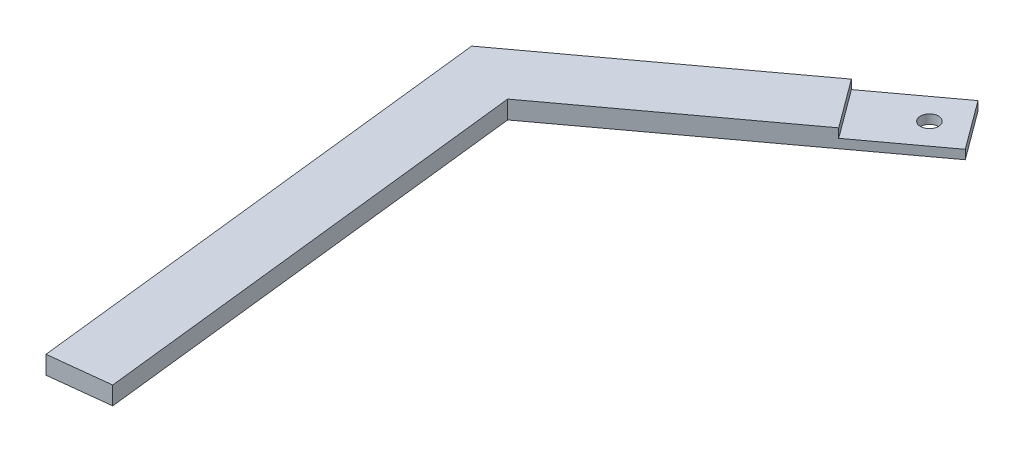
ISO-10303-21;
HEADER;
FILE_DESCRIPTION(('STEP AP214'),'2;1');
FILE_NAME('part.step','',(''),(''),'','','');
FILE_SCHEMA(('AUTOMOTIVE_DESIGN { 1 0 10303 214 1 1 1 1 }'));
ENDSEC;
DATA;
#1=APPLICATION_CONTEXT('core data for automotive mechanical design processes');
#2=APPLICATION_PROTOCOL_DEFINITION('international standard','automotive_design',2000,#1);
#3=PRODUCT_CONTEXT('',#1,'mechanical');
#4=PRODUCT('Part','Part','',(#3));
#5=PRODUCT_RELATED_PRODUCT_CATEGORY('part','',(#4));
#6=PRODUCT_DEFINITION_FORMATION('','',#4);
#7=PRODUCT_DEFINITION_CONTEXT('part definition',#1,'design');
#8=PRODUCT_DEFINITION('design','',#6,#7);
#9=PRODUCT_DEFINITION_SHAPE('','',#8);
#10=(LENGTH_UNIT() NAMED_UNIT(*) SI_UNIT(.MILLI.,.METRE.));
#11=(NAMED_UNIT(*) PLANE_ANGLE_UNIT() SI_UNIT($,.RADIAN.));
#12=(NAMED_UNIT(*) SI_UNIT($,.STERADIAN.) SOLID_ANGLE_UNIT());
#13=UNCERTAINTY_MEASURE_WITH_UNIT(LENGTH_MEASURE(1.E-05),#10,'distance_accuracy_value','');
#14=(GEOMETRIC_REPRESENTATION_CONTEXT(3) GLOBAL_UNCERTAINTY_ASSIGNED_CONTEXT((#13)) GLOBAL_UNIT_ASSIGNED_CONTEXT((#10,
#11,#12)) REPRESENTATION_CONTEXT('',''));
#15=CARTESIAN_POINT('',(0.,0.,0.));
#16=DIRECTION('',(0.,0.,1.));
#17=DIRECTION('',(1.,0.,0.));
#18=AXIS2_PLACEMENT_3D('',#15,#16,#17);
#19=CARTESIAN_POINT('',(24.1967092916066,3.,-21.4320700444893));
#20=DIRECTION('',(-0.804559283659568,0.,0.593872342408031));
#21=DIRECTION('',(0.593872342408031,0.,0.804559283659568));
#22=AXIS2_PLACEMENT_3D('',#19,#20,#21);
#23=PLANE('',#22);
#24=DIRECTION('',(-0.593872342408031,0.,-0.804559283659568));
#25=VECTOR('',#24,1.);
#26=CARTESIAN_POINT('',(18.2579858675263,1.5,-29.477662881085));
#27=LINE('',#26,#25);
#28=CARTESIAN_POINT('',(24.1967092916066,1.5,-21.4320700444893));
#29=VERTEX_POINT('',#28);
#30=CARTESIAN_POINT('',(18.2579858675263,1.5,-29.477662881085));
#31=VERTEX_POINT('',#30);
#32=EDGE_CURVE('E124',#29,#31,#27,.T.);
#33=ORIENTED_EDGE('',*,*,#32,.F.);
#34=DIRECTION('',(0.,-1.,0.));
#35=VECTOR('',#34,1.);
#36=CARTESIAN_POINT('',(24.1967092916066,3.,-21.4320700444893));
#37=LINE('',#36,#35);
#38=CARTESIAN_POINT('',(24.1967092916066,0.,-21.4320700444893));
#39=VERTEX_POINT('',#38);
#40=EDGE_CURVE('E90',#29,#39,#37,.T.);
#41=ORIENTED_EDGE('',*,*,#40,.T.);
#42=DIRECTION('',(-0.593872342408031,0.,-0.804559283659568));
#43=VECTOR('',#42,1.);
#44=CARTESIAN_POINT('',(24.1967092916066,0.,-21.4320700444893));
#45=LINE('',#44,#43);
#46=CARTESIAN_POINT('',(18.2579858675263,0.,-29.477662881085));
#47=VERTEX_POINT('',#46);
#48=EDGE_CURVE('E135',#39,#47,#45,.T.);
#49=ORIENTED_EDGE('',*,*,#48,.T.);
#50=DIRECTION('',(0.,-1.,0.));
#51=VECTOR('',#50,1.);
#52=CARTESIAN_POINT('',(18.2579858675263,3.,-29.477662881085));
#53=LINE('',#52,#51);
#54=EDGE_CURVE('E11',#31,#47,#53,.T.);
#55=ORIENTED_EDGE('',*,*,#54,.F.);
#56=EDGE_LOOP('',(#33,#41,#49,#55));
#57=FACE_BOUND('',#56,.T.);
#58=ADVANCED_FACE('F39',(#57),#23,.F.);
#59=CARTESIAN_POINT('',(18.2579858675263,3.,-29.477662881085));
#60=DIRECTION('',(0.593872342408031,0.,0.804559283659569));
#61=DIRECTION('',(0.804559283659569,0.,-0.593872342408031));
#62=AXIS2_PLACEMENT_3D('',#59,#60,#61);
#63=PLANE('',#62);
#64=DIRECTION('',(-0.804559283659569,0.,0.593872342408031));
#65=VECTOR('',#64,1.);
#66=CARTESIAN_POINT('',(18.2579858675263,3.,-29.477662881085));
#67=LINE('',#66,#65);
#68=CARTESIAN_POINT('',(6.18959661263277,3.,-20.5695777449646));
#69=VERTEX_POINT('',#68);
#70=CARTESIAN_POINT('',(-30.0155711520478,3.,6.15467766339683));
#71=VERTEX_POINT('',#70);
#72=EDGE_CURVE('E96',#69,#71,#67,.T.);
#73=ORIENTED_EDGE('',*,*,#72,.F.);
#74=DIRECTION('',(0.,1.,0.));
#75=VECTOR('',#74,1.);
#76=CARTESIAN_POINT('',(6.18959661263278,1.5,-20.5695777449646));
#77=LINE('',#76,#75);
#78=CARTESIAN_POINT('',(6.18959661263278,1.5,-20.5695777449646));
#79=VERTEX_POINT('',#78);
#80=EDGE_CURVE('E54',#79,#69,#77,.T.);
#81=ORIENTED_EDGE('',*,*,#80,.F.);
#82=DIRECTION('',(-0.804559283659568,0.,0.593872342408032));
#83=VECTOR('',#82,1.);
#84=CARTESIAN_POINT('',(18.2579858675263,1.5,-29.477662881085));
#85=LINE('',#84,#83);
#86=EDGE_CURVE('E120',#31,#79,#85,.T.);
#87=ORIENTED_EDGE('',*,*,#86,.F.);
#88=ORIENTED_EDGE('',*,*,#54,.T.);
#89=DIRECTION('',(-0.804559283659569,0.,0.593872342408031));
#90=VECTOR('',#89,1.);
#91=CARTESIAN_POINT('',(18.2579858675263,0.,-29.477662881085));
#92=LINE('',#91,#90);
#93=CARTESIAN_POINT('',(-30.0155711520478,0.,6.15467766339683));
#94=VERTEX_POINT('',#93);
#95=EDGE_CURVE('E156',#47,#94,#92,.T.);
#96=ORIENTED_EDGE('',*,*,#95,.T.);
#97=DIRECTION('',(0.,-1.,0.));
#98=VECTOR('',#97,1.);
#99=CARTESIAN_POINT('',(-30.0155711520478,3.,6.15467766339683));
#100=LINE('',#99,#98);
#101=EDGE_CURVE('E47',#71,#94,#100,.T.);
#102=ORIENTED_EDGE('',*,*,#101,.F.);
#103=EDGE_LOOP('',(#73,#81,#87,#88,#96,#102));
#104=FACE_BOUND('',#103,.T.);
#105=ADVANCED_FACE('F130',(#104),#63,.F.);
#106=CARTESIAN_POINT('',(-30.0155711520478,3.,6.15467766339683));
#107=DIRECTION('',(0.993704949703812,0.,-0.112028893300543));
#108=DIRECTION('',(-0.112028893300543,0.,-0.993704949703812));
#109=AXIS2_PLACEMENT_3D('',#106,#107,#108);
#110=PLANE('',#109);
#111=DIRECTION('',(0.112028893300543,0.,0.993704949703812));
#112=VECTOR('',#111,1.);
#113=CARTESIAN_POINT('',(-30.0155711520478,0.,6.15467766339683));
#114=LINE('',#113,#112);
#115=CARTESIAN_POINT('',(-21.0532596880044,0.,85.6510736397018));
#116=VERTEX_POINT('',#115);
#117=EDGE_CURVE('E159',#94,#116,#114,.T.);
#118=ORIENTED_EDGE('',*,*,#117,.T.);
#119=DIRECTION('',(0.,-1.,0.));
#120=VECTOR('',#119,1.);
#121=CARTESIAN_POINT('',(-21.0532596880044,3.,85.6510736397018));
#122=LINE('',#121,#120);
#123=CARTESIAN_POINT('',(-21.0532596880044,3.,85.6510736397018));
#124=VERTEX_POINT('',#123);
#125=EDGE_CURVE('E180',#124,#116,#122,.T.);
#126=ORIENTED_EDGE('',*,*,#125,.F.);
#127=DIRECTION('',(0.112028893300543,0.,0.993704949703812));
#128=VECTOR('',#127,1.);
#129=CARTESIAN_POINT('',(-30.0155711520478,3.,6.15467766339683));
#130=LINE('',#129,#128);
#131=EDGE_CURVE('E142',#71,#124,#130,.T.);
#132=ORIENTED_EDGE('',*,*,#131,.F.);
#133=ORIENTED_EDGE('',*,*,#101,.T.);
#134=EDGE_LOOP('',(#118,#126,#132,#133));
#135=FACE_BOUND('',#134,.T.);
#136=ADVANCED_FACE('F188',(#135),#110,.F.);
#137=CARTESIAN_POINT('',(-21.0532596880044,3.,85.6510736397018));
#138=DIRECTION('',(-0.112028893300542,0.,-0.993704949703812));
#139=DIRECTION('',(-0.993704949703812,0.,0.112028893300542));
#140=AXIS2_PLACEMENT_3D('',#137,#138,#139);
#141=PLANE('',#140);
#142=DIRECTION('',(0.993704949703812,0.,-0.112028893300542));
#143=VECTOR('',#142,1.);
#144=CARTESIAN_POINT('',(-21.0532596880044,0.,85.6510736397018));
#145=LINE('',#144,#143);
#146=CARTESIAN_POINT('',(-11.1162101909663,0.,84.5307847066964));
#147=VERTEX_POINT('',#146);
#148=EDGE_CURVE('E162',#116,#147,#145,.T.);
#149=ORIENTED_EDGE('',*,*,#148,.T.);
#150=DIRECTION('',(0.,-1.,0.));
#151=VECTOR('',#150,1.);
#152=CARTESIAN_POINT('',(-11.1162101909663,3.,84.5307847066964));
#153=LINE('',#152,#151);
#154=CARTESIAN_POINT('',(-11.1162101909663,3.,84.5307847066964));
#155=VERTEX_POINT('',#154);
#156=EDGE_CURVE('E176',#155,#147,#153,.T.);
#157=ORIENTED_EDGE('',*,*,#156,.F.);
#158=DIRECTION('',(0.993704949703812,0.,-0.112028893300542));
#159=VECTOR('',#158,1.);
#160=CARTESIAN_POINT('',(-21.0532596880044,3.,85.6510736397018));
#161=LINE('',#160,#159);
#162=EDGE_CURVE('E146',#124,#155,#161,.T.);
#163=ORIENTED_EDGE('',*,*,#162,.F.);
#164=ORIENTED_EDGE('',*,*,#125,.T.);
#165=EDGE_LOOP('',(#149,#157,#163,#164));
#166=FACE_BOUND('',#165,.T.);
#167=ADVANCED_FACE('F199',(#166),#141,.F.);
#168=CARTESIAN_POINT('',(-11.1162101909663,3.,84.5307847066964));
#169=DIRECTION('',(-0.993704949703812,0.,0.112028893300543));
#170=DIRECTION('',(0.112028893300543,0.,0.993704949703812));
#171=AXIS2_PLACEMENT_3D('',#168,#169,#170);
#172=PLANE('',#171);
#173=DIRECTION('',(-0.112028893300543,0.,-0.993704949703812));
#174=VECTOR('',#173,1.);
#175=CARTESIAN_POINT('',(-11.1162101909663,0.,84.5307847066964));
#176=LINE('',#175,#174);
#177=CARTESIAN_POINT('',(-19.4317225379689,0.,10.771546932457));
#178=VERTEX_POINT('',#177);
#179=EDGE_CURVE('E165',#147,#178,#176,.T.);
#180=ORIENTED_EDGE('',*,*,#179,.T.);
#181=DIRECTION('',(0.,-1.,0.));
#182=VECTOR('',#181,1.);
#183=CARTESIAN_POINT('',(-19.4317225379689,3.,10.771546932457));
#184=LINE('',#183,#182);
#185=CARTESIAN_POINT('',(-19.4317225379689,3.,10.771546932457));
#186=VERTEX_POINT('',#185);
#187=EDGE_CURVE('E172',#186,#178,#184,.T.);
#188=ORIENTED_EDGE('',*,*,#187,.F.);
#189=DIRECTION('',(-0.112028893300543,0.,-0.993704949703812));
#190=VECTOR('',#189,1.);
#191=CARTESIAN_POINT('',(-11.1162101909663,3.,84.5307847066964));
#192=LINE('',#191,#190);
#193=EDGE_CURVE('E63',#155,#186,#192,.T.);
#194=ORIENTED_EDGE('',*,*,#193,.F.);
#195=ORIENTED_EDGE('',*,*,#156,.T.);
#196=EDGE_LOOP('',(#180,#188,#194,#195));
#197=FACE_BOUND('',#196,.T.);
#198=ADVANCED_FACE('F202',(#197),#172,.F.);
#199=CARTESIAN_POINT('',(-19.4317225379689,3.,10.771546932457));
#200=DIRECTION('',(-0.593872342408031,0.,-0.804559283659569));
#201=DIRECTION('',(-0.804559283659569,0.,0.593872342408031));
#202=AXIS2_PLACEMENT_3D('',#199,#200,#201);
#203=PLANE('',#202);
#204=DIRECTION('',(0.804559283659568,0.,-0.593872342408031));
#205=VECTOR('',#204,1.);
#206=CARTESIAN_POINT('',(24.1967092916066,1.5,-21.4320700444893));
#207=LINE('',#206,#205);
#208=CARTESIAN_POINT('',(12.1283200367131,1.5,-12.5239849083689));
#209=VERTEX_POINT('',#208);
#210=EDGE_CURVE('E119',#209,#29,#207,.T.);
#211=ORIENTED_EDGE('',*,*,#210,.F.);
#212=DIRECTION('',(0.,1.,0.));
#213=VECTOR('',#212,1.);
#214=CARTESIAN_POINT('',(12.1283200367131,1.5,-12.5239849083689));
#215=LINE('',#214,#213);
#216=CARTESIAN_POINT('',(12.1283200367131,3.,-12.5239849083689));
#217=VERTEX_POINT('',#216);
#218=EDGE_CURVE('E115',#209,#217,#215,.T.);
#219=ORIENTED_EDGE('',*,*,#218,.T.);
#220=DIRECTION('',(0.804559283659569,0.,-0.593872342408031));
#221=VECTOR('',#220,1.);
#222=CARTESIAN_POINT('',(-19.4317225379689,3.,10.771546932457));
#223=LINE('',#222,#221);
#224=EDGE_CURVE('E151',#186,#217,#223,.T.);
#225=ORIENTED_EDGE('',*,*,#224,.F.);
#226=ORIENTED_EDGE('',*,*,#187,.T.);
#227=DIRECTION('',(0.804559283659569,0.,-0.593872342408031));
#228=VECTOR('',#227,1.);
#229=CARTESIAN_POINT('',(-19.4317225379689,0.,10.771546932457));
#230=LINE('',#229,#228);
#231=EDGE_CURVE('E143',#178,#39,#230,.T.);
#232=ORIENTED_EDGE('',*,*,#231,.T.);
#233=ORIENTED_EDGE('',*,*,#40,.F.);
#234=EDGE_LOOP('',(#211,#219,#225,#226,#232,#233));
#235=FACE_BOUND('',#234,.T.);
#236=ADVANCED_FACE('F205',(#235),#203,.F.);
#237=CARTESIAN_POINT('',(0.,3.,0.));
#238=DIRECTION('',(0.,1.,0.));
#239=DIRECTION('',(0.,0.,1.));
#240=AXIS2_PLACEMENT_3D('',#237,#238,#239);
#241=PLANE('',#240);
#242=DIRECTION('',(0.593872342408032,0.,0.804559283659568));
#243=VECTOR('',#242,1.);
#244=CARTESIAN_POINT('',(6.18959661263278,3.,-20.5695777449646));
#245=LINE('',#244,#243);
#246=EDGE_CURVE('E128',#69,#217,#245,.T.);
#247=ORIENTED_EDGE('',*,*,#246,.F.);
#248=ORIENTED_EDGE('',*,*,#72,.T.);
#249=ORIENTED_EDGE('',*,*,#131,.T.);
#250=ORIENTED_EDGE('',*,*,#162,.T.);
#251=ORIENTED_EDGE('',*,*,#193,.T.);
#252=ORIENTED_EDGE('',*,*,#224,.T.);
#253=EDGE_LOOP('',(#247,#248,#249,#250,#251,#252));
#254=FACE_BOUND('',#253,.T.);
#255=ADVANCED_FACE('F206',(#254),#241,.T.);
#256=CARTESIAN_POINT('',(0.,0.,0.));
#257=DIRECTION('',(0.,1.,0.));
#258=DIRECTION('',(0.,0.,1.));
#259=AXIS2_PLACEMENT_3D('',#256,#257,#258);
#260=PLANE('',#259);
#261=CARTESIAN_POINT('',(17.2045511612686,0.,-22.485504750747));
#262=DIRECTION('',(0.,1.,0.));
#263=DIRECTION('',(0.,0.,1.));
#264=AXIS2_PLACEMENT_3D('',#261,#262,#263);
#265=CIRCLE('',#264,1.5);
#266=CARTESIAN_POINT('',(17.2045511612686,0.,-20.985504750747));
#267=VERTEX_POINT('',#266);
#268=EDGE_CURVE('E208',#267,#267,#265,.T.);
#269=ORIENTED_EDGE('',*,*,#268,.T.);
#270=EDGE_LOOP('',(#269));
#271=FACE_BOUND('',#270,.T.);
#272=ORIENTED_EDGE('',*,*,#48,.F.);
#273=ORIENTED_EDGE('',*,*,#231,.F.);
#274=ORIENTED_EDGE('',*,*,#179,.F.);
#275=ORIENTED_EDGE('',*,*,#148,.F.);
#276=ORIENTED_EDGE('',*,*,#117,.F.);
#277=ORIENTED_EDGE('',*,*,#95,.F.);
#278=EDGE_LOOP('',(#272,#273,#274,#275,#276,#277));
#279=FACE_BOUND('',#278,.T.);
#280=ADVANCED_FACE('F194',(#271,#279),#260,.F.);
#281=CARTESIAN_POINT('',(6.18959661263278,1.5,-20.5695777449646));
#282=DIRECTION('',(-0.804559283659568,0.,0.593872342408031));
#283=DIRECTION('',(0.593872342408032,0.,0.804559283659569));
#284=AXIS2_PLACEMENT_3D('',#281,#282,#283);
#285=PLANE('',#284);
#286=ORIENTED_EDGE('',*,*,#246,.T.);
#287=ORIENTED_EDGE('',*,*,#218,.F.);
#288=DIRECTION('',(0.593872342408032,0.,0.804559283659568));
#289=VECTOR('',#288,1.);
#290=CARTESIAN_POINT('',(6.18959661263278,1.5,-20.5695777449646));
#291=LINE('',#290,#289);
#292=EDGE_CURVE('E111',#79,#209,#291,.T.);
#293=ORIENTED_EDGE('',*,*,#292,.F.);
#294=ORIENTED_EDGE('',*,*,#80,.T.);
#295=EDGE_LOOP('',(#286,#287,#293,#294));
#296=FACE_BOUND('',#295,.T.);
#297=ADVANCED_FACE('F113',(#296),#285,.F.);
#298=CARTESIAN_POINT('',(0.,1.5,0.));
#299=DIRECTION('',(0.,1.,0.));
#300=DIRECTION('',(0.,0.,1.));
#301=AXIS2_PLACEMENT_3D('',#298,#299,#300);
#302=PLANE('',#301);
#303=CARTESIAN_POINT('',(17.2045511612686,1.5,-22.485504750747));
#304=DIRECTION('',(0.,1.,0.));
#305=DIRECTION('',(0.,0.,1.));
#306=AXIS2_PLACEMENT_3D('',#303,#304,#305);
#307=CIRCLE('',#306,1.5);
#308=CARTESIAN_POINT('',(17.2045511612686,1.5,-20.985504750747));
#309=VERTEX_POINT('',#308);
#310=EDGE_CURVE('E211',#309,#309,#307,.T.);
#311=ORIENTED_EDGE('',*,*,#310,.F.);
#312=EDGE_LOOP('',(#311));
#313=FACE_BOUND('',#312,.T.);
#314=ORIENTED_EDGE('',*,*,#86,.T.);
#315=ORIENTED_EDGE('',*,*,#292,.T.);
#316=ORIENTED_EDGE('',*,*,#210,.T.);
#317=ORIENTED_EDGE('',*,*,#32,.T.);
#318=EDGE_LOOP('',(#314,#315,#316,#317));
#319=FACE_BOUND('',#318,.T.);
#320=ADVANCED_FACE('F123',(#313,#319),#302,.T.);
#321=CARTESIAN_POINT('',(17.2045511612686,0.,-22.485504750747));
#322=DIRECTION('',(0.,1.,0.));
#323=DIRECTION('',(0.,0.,1.));
#324=AXIS2_PLACEMENT_3D('',#321,#322,#323);
#325=CYLINDRICAL_SURFACE('',#324,1.5);
#326=ORIENTED_EDGE('',*,*,#268,.F.);
#327=EDGE_LOOP('',(#326));
#328=FACE_BOUND('',#327,.T.);
#329=ORIENTED_EDGE('',*,*,#310,.T.);
#330=EDGE_LOOP('',(#329));
#331=FACE_BOUND('',#330,.T.);
#332=ADVANCED_FACE('F220',(#328,#331),#325,.F.);
#333=CLOSED_SHELL('',(#58,#105,#136,#167,#198,#236,#255,#280,#297,#320,#332));
#334=MANIFOLD_SOLID_BREP('B2',#333);
#335=ADVANCED_BREP_SHAPE_REPRESENTATION('',(#18,#334),#14);
#336=SHAPE_DEFINITION_REPRESENTATION(#9,#335);
ENDSEC;
END-ISO-10303-21;
